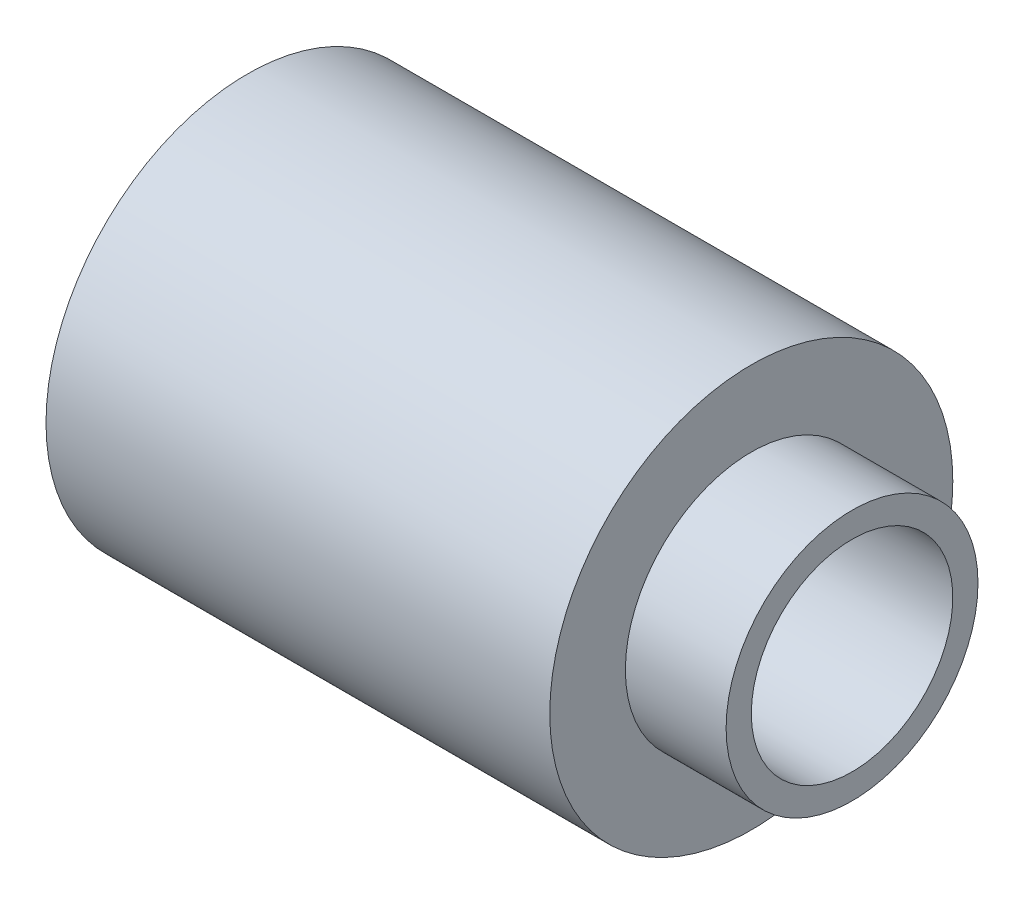
ISO-10303-21;
HEADER;
FILE_DESCRIPTION(('STEP AP214'),'2;1');
FILE_NAME('part.step','',(''),(''),'','','');
FILE_SCHEMA(('AUTOMOTIVE_DESIGN { 1 0 10303 214 1 1 1 1 }'));
ENDSEC;
DATA;
#1=APPLICATION_CONTEXT('core data for automotive mechanical design processes');
#2=APPLICATION_PROTOCOL_DEFINITION('international standard','automotive_design',2000,#1);
#3=PRODUCT_CONTEXT('',#1,'mechanical');
#4=PRODUCT('Part','Part','',(#3));
#5=PRODUCT_RELATED_PRODUCT_CATEGORY('part','',(#4));
#6=PRODUCT_DEFINITION_FORMATION('','',#4);
#7=PRODUCT_DEFINITION_CONTEXT('part definition',#1,'design');
#8=PRODUCT_DEFINITION('design','',#6,#7);
#9=PRODUCT_DEFINITION_SHAPE('','',#8);
#10=(LENGTH_UNIT() NAMED_UNIT(*) SI_UNIT(.MILLI.,.METRE.));
#11=(NAMED_UNIT(*) PLANE_ANGLE_UNIT() SI_UNIT($,.RADIAN.));
#12=(NAMED_UNIT(*) SI_UNIT($,.STERADIAN.) SOLID_ANGLE_UNIT());
#13=UNCERTAINTY_MEASURE_WITH_UNIT(LENGTH_MEASURE(1.E-05),#10,'distance_accuracy_value','');
#14=(GEOMETRIC_REPRESENTATION_CONTEXT(3) GLOBAL_UNCERTAINTY_ASSIGNED_CONTEXT((#13)) GLOBAL_UNIT_ASSIGNED_CONTEXT((#10,
#11,#12)) REPRESENTATION_CONTEXT('',''));
#15=CARTESIAN_POINT('',(0.,0.,0.));
#16=DIRECTION('',(0.,0.,1.));
#17=DIRECTION('',(1.,0.,0.));
#18=AXIS2_PLACEMENT_3D('',#15,#16,#17);
#19=CARTESIAN_POINT('',(-4.77276566171911,0.,0.));
#20=DIRECTION('',(-1.,0.,0.));
#21=DIRECTION('',(0.,0.,1.));
#22=AXIS2_PLACEMENT_3D('',#19,#20,#21);
#23=CYLINDRICAL_SURFACE('',#22,2.);
#24=CARTESIAN_POINT('',(2.,0.,0.));
#25=DIRECTION('',(-1.,0.,0.));
#26=DIRECTION('',(0.,0.,1.));
#27=AXIS2_PLACEMENT_3D('',#24,#25,#26);
#28=CIRCLE('',#27,2.);
#29=CARTESIAN_POINT('',(2.,0.,2.));
#30=VERTEX_POINT('',#29);
#31=EDGE_CURVE('E58',#30,#30,#28,.T.);
#32=ORIENTED_EDGE('',*,*,#31,.F.);
#33=EDGE_LOOP('',(#32));
#34=FACE_BOUND('',#33,.T.);
#35=CARTESIAN_POINT('',(-10.,0.,0.));
#36=DIRECTION('',(-1.,0.,0.));
#37=DIRECTION('',(0.,0.,1.));
#38=AXIS2_PLACEMENT_3D('',#35,#36,#37);
#39=CIRCLE('',#38,2.);
#40=CARTESIAN_POINT('',(-10.,0.,2.));
#41=VERTEX_POINT('',#40);
#42=EDGE_CURVE('E10',#41,#41,#39,.T.);
#43=ORIENTED_EDGE('',*,*,#42,.T.);
#44=EDGE_LOOP('',(#43));
#45=FACE_BOUND('',#44,.T.);
#46=ADVANCED_FACE('F36',(#34,#45),#23,.F.);
#47=CARTESIAN_POINT('',(-10.,2.,0.));
#48=DIRECTION('',(1.,0.,0.));
#49=DIRECTION('',(0.,0.,-1.));
#50=AXIS2_PLACEMENT_3D('',#47,#48,#49);
#51=PLANE('',#50);
#52=ORIENTED_EDGE('',*,*,#42,.F.);
#53=EDGE_LOOP('',(#52));
#54=FACE_BOUND('',#53,.T.);
#55=CARTESIAN_POINT('',(-10.,0.,0.));
#56=DIRECTION('',(-1.,0.,0.));
#57=DIRECTION('',(0.,0.,1.));
#58=AXIS2_PLACEMENT_3D('',#55,#56,#57);
#59=CIRCLE('',#58,4.);
#60=CARTESIAN_POINT('',(-10.,0.,4.));
#61=VERTEX_POINT('',#60);
#62=EDGE_CURVE('E42',#61,#61,#59,.T.);
#63=ORIENTED_EDGE('',*,*,#62,.T.);
#64=EDGE_LOOP('',(#63));
#65=FACE_BOUND('',#64,.T.);
#66=ADVANCED_FACE('F65',(#54,#65),#51,.F.);
#67=CARTESIAN_POINT('',(-4.77276566171911,0.,0.));
#68=DIRECTION('',(-1.,0.,0.));
#69=DIRECTION('',(0.,0.,1.));
#70=AXIS2_PLACEMENT_3D('',#67,#68,#69);
#71=CYLINDRICAL_SURFACE('',#70,4.);
#72=ORIENTED_EDGE('',*,*,#62,.F.);
#73=EDGE_LOOP('',(#72));
#74=FACE_BOUND('',#73,.T.);
#75=CARTESIAN_POINT('',(0.,0.,0.));
#76=DIRECTION('',(-1.,0.,0.));
#77=DIRECTION('',(0.,0.,1.));
#78=AXIS2_PLACEMENT_3D('',#75,#76,#77);
#79=CIRCLE('',#78,4.);
#80=CARTESIAN_POINT('',(0.,0.,4.));
#81=VERTEX_POINT('',#80);
#82=EDGE_CURVE('E46',#81,#81,#79,.T.);
#83=ORIENTED_EDGE('',*,*,#82,.T.);
#84=EDGE_LOOP('',(#83));
#85=FACE_BOUND('',#84,.T.);
#86=ADVANCED_FACE('F69',(#74,#85),#71,.T.);
#87=CARTESIAN_POINT('',(0.,4.,0.));
#88=DIRECTION('',(-1.,0.,0.));
#89=DIRECTION('',(0.,0.,1.));
#90=AXIS2_PLACEMENT_3D('',#87,#88,#89);
#91=PLANE('',#90);
#92=ORIENTED_EDGE('',*,*,#82,.F.);
#93=EDGE_LOOP('',(#92));
#94=FACE_BOUND('',#93,.T.);
#95=CARTESIAN_POINT('',(0.,0.,0.));
#96=DIRECTION('',(-1.,0.,0.));
#97=DIRECTION('',(0.,0.,1.));
#98=AXIS2_PLACEMENT_3D('',#95,#96,#97);
#99=CIRCLE('',#98,2.5);
#100=CARTESIAN_POINT('',(0.,0.,2.5));
#101=VERTEX_POINT('',#100);
#102=EDGE_CURVE('E50',#101,#101,#99,.T.);
#103=ORIENTED_EDGE('',*,*,#102,.T.);
#104=EDGE_LOOP('',(#103));
#105=FACE_BOUND('',#104,.T.);
#106=ADVANCED_FACE('F74',(#94,#105),#91,.F.);
#107=CARTESIAN_POINT('',(-4.77276566171911,0.,0.));
#108=DIRECTION('',(-1.,0.,0.));
#109=DIRECTION('',(0.,0.,1.));
#110=AXIS2_PLACEMENT_3D('',#107,#108,#109);
#111=CYLINDRICAL_SURFACE('',#110,2.5);
#112=ORIENTED_EDGE('',*,*,#102,.F.);
#113=EDGE_LOOP('',(#112));
#114=FACE_BOUND('',#113,.T.);
#115=CARTESIAN_POINT('',(2.,0.,0.));
#116=DIRECTION('',(-1.,0.,0.));
#117=DIRECTION('',(0.,0.,1.));
#118=AXIS2_PLACEMENT_3D('',#115,#116,#117);
#119=CIRCLE('',#118,2.5);
#120=CARTESIAN_POINT('',(2.,0.,2.5));
#121=VERTEX_POINT('',#120);
#122=EDGE_CURVE('E55',#121,#121,#119,.T.);
#123=ORIENTED_EDGE('',*,*,#122,.T.);
#124=EDGE_LOOP('',(#123));
#125=FACE_BOUND('',#124,.T.);
#126=ADVANCED_FACE('F80',(#114,#125),#111,.T.);
#127=CARTESIAN_POINT('',(2.,2.5,0.));
#128=DIRECTION('',(-1.,0.,0.));
#129=DIRECTION('',(0.,0.,1.));
#130=AXIS2_PLACEMENT_3D('',#127,#128,#129);
#131=PLANE('',#130);
#132=ORIENTED_EDGE('',*,*,#122,.F.);
#133=EDGE_LOOP('',(#132));
#134=FACE_BOUND('',#133,.T.);
#135=ORIENTED_EDGE('',*,*,#31,.T.);
#136=EDGE_LOOP('',(#135));
#137=FACE_BOUND('',#136,.T.);
#138=ADVANCED_FACE('F62',(#134,#137),#131,.F.);
#139=CLOSED_SHELL('',(#46,#66,#86,#106,#126,#138));
#140=MANIFOLD_SOLID_BREP('B2',#139);
#141=ADVANCED_BREP_SHAPE_REPRESENTATION('',(#18,#140),#14);
#142=SHAPE_DEFINITION_REPRESENTATION(#9,#141);
ENDSEC;
END-ISO-10303-21;
